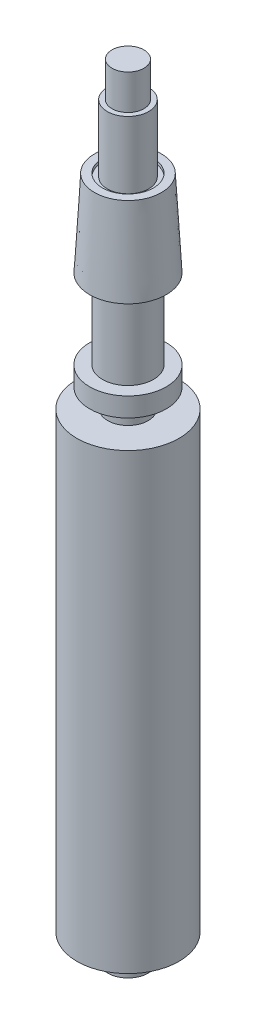
ISO-10303-21;
HEADER;
FILE_DESCRIPTION(('STEP AP214'),'2;1');
FILE_NAME('part.step','',(''),(''),'','','');
FILE_SCHEMA(('AUTOMOTIVE_DESIGN { 1 0 10303 214 1 1 1 1 }'));
ENDSEC;
DATA;
#1=APPLICATION_CONTEXT('core data for automotive mechanical design processes');
#2=APPLICATION_PROTOCOL_DEFINITION('international standard','automotive_design',2000,#1);
#3=PRODUCT_CONTEXT('',#1,'mechanical');
#4=PRODUCT('Part','Part','',(#3));
#5=PRODUCT_RELATED_PRODUCT_CATEGORY('part','',(#4));
#6=PRODUCT_DEFINITION_FORMATION('','',#4);
#7=PRODUCT_DEFINITION_CONTEXT('part definition',#1,'design');
#8=PRODUCT_DEFINITION('design','',#6,#7);
#9=PRODUCT_DEFINITION_SHAPE('','',#8);
#10=(LENGTH_UNIT() NAMED_UNIT(*) SI_UNIT(.MILLI.,.METRE.));
#11=(NAMED_UNIT(*) PLANE_ANGLE_UNIT() SI_UNIT($,.RADIAN.));
#12=(NAMED_UNIT(*) SI_UNIT($,.STERADIAN.) SOLID_ANGLE_UNIT());
#13=UNCERTAINTY_MEASURE_WITH_UNIT(LENGTH_MEASURE(1.E-05),#10,'distance_accuracy_value','');
#14=(GEOMETRIC_REPRESENTATION_CONTEXT(3) GLOBAL_UNCERTAINTY_ASSIGNED_CONTEXT((#13)) GLOBAL_UNIT_ASSIGNED_CONTEXT((#10,
#11,#12)) REPRESENTATION_CONTEXT('',''));
#15=CARTESIAN_POINT('',(0.,0.,0.));
#16=DIRECTION('',(0.,0.,1.));
#17=DIRECTION('',(1.,0.,0.));
#18=AXIS2_PLACEMENT_3D('',#15,#16,#17);
#19=CARTESIAN_POINT('',(0.,0.,0.));
#20=DIRECTION('',(0.,-1.,0.));
#21=DIRECTION('',(0.,0.,-1.));
#22=AXIS2_PLACEMENT_3D('',#19,#20,#21);
#23=PLANE('',#22);
#24=CARTESIAN_POINT('',(0.,0.,0.));
#25=DIRECTION('',(0.,1.,0.));
#26=DIRECTION('',(0.,0.,1.));
#27=AXIS2_PLACEMENT_3D('',#24,#25,#26);
#28=CIRCLE('',#27,5.);
#29=CARTESIAN_POINT('',(0.,0.,5.));
#30=VERTEX_POINT('',#29);
#31=EDGE_CURVE('E10',#30,#30,#28,.T.);
#32=ORIENTED_EDGE('',*,*,#31,.T.);
#33=EDGE_LOOP('',(#32));
#34=FACE_BOUND('',#33,.T.);
#35=ADVANCED_FACE('F43',(#34),#23,.F.);
#36=CARTESIAN_POINT('',(0.,0.,0.));
#37=DIRECTION('',(0.,1.,0.));
#38=DIRECTION('',(0.,0.,1.));
#39=AXIS2_PLACEMENT_3D('',#36,#37,#38);
#40=CYLINDRICAL_SURFACE('',#39,5.);
#41=ORIENTED_EDGE('',*,*,#31,.F.);
#42=EDGE_LOOP('',(#41));
#43=FACE_BOUND('',#42,.T.);
#44=CARTESIAN_POINT('',(0.,-11.,0.));
#45=DIRECTION('',(0.,1.,0.));
#46=DIRECTION('',(0.,0.,1.));
#47=AXIS2_PLACEMENT_3D('',#44,#45,#46);
#48=CIRCLE('',#47,5.);
#49=CARTESIAN_POINT('',(0.,-11.,5.));
#50=VERTEX_POINT('',#49);
#51=EDGE_CURVE('E49',#50,#50,#48,.T.);
#52=ORIENTED_EDGE('',*,*,#51,.T.);
#53=EDGE_LOOP('',(#52));
#54=FACE_BOUND('',#53,.T.);
#55=ADVANCED_FACE('F134',(#43,#54),#40,.T.);
#56=CARTESIAN_POINT('',(5.,-11.,0.));
#57=DIRECTION('',(0.,-1.,0.));
#58=DIRECTION('',(0.,0.,-1.));
#59=AXIS2_PLACEMENT_3D('',#56,#57,#58);
#60=PLANE('',#59);
#61=ORIENTED_EDGE('',*,*,#51,.F.);
#62=EDGE_LOOP('',(#61));
#63=FACE_BOUND('',#62,.T.);
#64=CARTESIAN_POINT('',(0.,-11.,0.));
#65=DIRECTION('',(0.,1.,0.));
#66=DIRECTION('',(0.,0.,1.));
#67=AXIS2_PLACEMENT_3D('',#64,#65,#66);
#68=CIRCLE('',#67,6.5);
#69=CARTESIAN_POINT('',(0.,-11.,6.5));
#70=VERTEX_POINT('',#69);
#71=EDGE_CURVE('E54',#70,#70,#68,.T.);
#72=ORIENTED_EDGE('',*,*,#71,.T.);
#73=EDGE_LOOP('',(#72));
#74=FACE_BOUND('',#73,.T.);
#75=ADVANCED_FACE('F137',(#63,#74),#60,.F.);
#76=CARTESIAN_POINT('',(0.,0.,0.));
#77=DIRECTION('',(0.,1.,0.));
#78=DIRECTION('',(0.,0.,1.));
#79=AXIS2_PLACEMENT_3D('',#76,#77,#78);
#80=CYLINDRICAL_SURFACE('',#79,6.5);
#81=ORIENTED_EDGE('',*,*,#71,.F.);
#82=EDGE_LOOP('',(#81));
#83=FACE_BOUND('',#82,.T.);
#84=CARTESIAN_POINT('',(0.,-32.,0.));
#85=DIRECTION('',(0.,1.,0.));
#86=DIRECTION('',(0.,0.,1.));
#87=AXIS2_PLACEMENT_3D('',#84,#85,#86);
#88=CIRCLE('',#87,6.5);
#89=CARTESIAN_POINT('',(0.,-32.,6.5));
#90=VERTEX_POINT('',#89);
#91=EDGE_CURVE('E58',#90,#90,#88,.T.);
#92=ORIENTED_EDGE('',*,*,#91,.T.);
#93=EDGE_LOOP('',(#92));
#94=FACE_BOUND('',#93,.T.);
#95=ADVANCED_FACE('F143',(#83,#94),#80,.T.);
#96=CARTESIAN_POINT('',(6.5,-32.,0.));
#97=DIRECTION('',(0.,-1.,0.));
#98=DIRECTION('',(0.,0.,-1.));
#99=AXIS2_PLACEMENT_3D('',#96,#97,#98);
#100=PLANE('',#99);
#101=ORIENTED_EDGE('',*,*,#91,.F.);
#102=EDGE_LOOP('',(#101));
#103=FACE_BOUND('',#102,.T.);
#104=CARTESIAN_POINT('',(0.,-32.,0.));
#105=DIRECTION('',(0.,1.,0.));
#106=DIRECTION('',(0.,0.,1.));
#107=AXIS2_PLACEMENT_3D('',#104,#105,#106);
#108=CIRCLE('',#107,8.00000000000001);
#109=CARTESIAN_POINT('',(0.,-32.,8.00000000000001));
#110=VERTEX_POINT('',#109);
#111=EDGE_CURVE('E67',#110,#110,#108,.T.);
#112=ORIENTED_EDGE('',*,*,#111,.T.);
#113=EDGE_LOOP('',(#112));
#114=FACE_BOUND('',#113,.T.);
#115=ADVANCED_FACE('F148',(#103,#114),#100,.F.);
#116=CARTESIAN_POINT('',(0.,0.,0.));
#117=DIRECTION('',(0.,1.,0.));
#118=DIRECTION('',(0.,0.,1.));
#119=AXIS2_PLACEMENT_3D('',#116,#117,#118);
#120=CYLINDRICAL_SURFACE('',#119,8.00000000000001);
#121=ORIENTED_EDGE('',*,*,#111,.F.);
#122=EDGE_LOOP('',(#121));
#123=FACE_BOUND('',#122,.T.);
#124=CARTESIAN_POINT('',(0.,-31.,0.));
#125=DIRECTION('',(0.,1.,0.));
#126=DIRECTION('',(0.,0.,1.));
#127=AXIS2_PLACEMENT_3D('',#124,#125,#126);
#128=CIRCLE('',#127,8.00000000000001);
#129=CARTESIAN_POINT('',(0.,-31.,8.00000000000001));
#130=VERTEX_POINT('',#129);
#131=EDGE_CURVE('E68',#130,#130,#128,.T.);
#132=ORIENTED_EDGE('',*,*,#131,.T.);
#133=EDGE_LOOP('',(#132));
#134=FACE_BOUND('',#133,.T.);
#135=ADVANCED_FACE('F153',(#123,#134),#120,.F.);
#136=CARTESIAN_POINT('',(10.5,-31.,0.));
#137=DIRECTION('',(0.,-1.,0.));
#138=DIRECTION('',(0.,0.,-1.));
#139=AXIS2_PLACEMENT_3D('',#136,#137,#138);
#140=PLANE('',#139);
#141=ORIENTED_EDGE('',*,*,#131,.F.);
#142=EDGE_LOOP('',(#141));
#143=FACE_BOUND('',#142,.T.);
#144=CARTESIAN_POINT('',(0.,-31.,0.));
#145=DIRECTION('',(0.,1.,0.));
#146=DIRECTION('',(0.,0.,1.));
#147=AXIS2_PLACEMENT_3D('',#144,#145,#146);
#148=CIRCLE('',#147,10.5);
#149=CARTESIAN_POINT('',(0.,-31.,10.5));
#150=VERTEX_POINT('',#149);
#151=EDGE_CURVE('E73',#150,#150,#148,.T.);
#152=ORIENTED_EDGE('',*,*,#151,.T.);
#153=EDGE_LOOP('',(#152));
#154=FACE_BOUND('',#153,.T.);
#155=ADVANCED_FACE('F156',(#143,#154),#140,.F.);
#156=CARTESIAN_POINT('',(0.,-58.,0.));
#157=DIRECTION('',(0.,-1.,0.));
#158=DIRECTION('',(0.,0.,-1.));
#159=AXIS2_PLACEMENT_3D('',#156,#157,#158);
#160=CONICAL_SURFACE('',#159,12.,0.055498505245717);
#161=ORIENTED_EDGE('',*,*,#151,.F.);
#162=EDGE_LOOP('',(#161));
#163=FACE_BOUND('',#162,.T.);
#164=CARTESIAN_POINT('',(0.,-58.,0.));
#165=DIRECTION('',(0.,1.,0.));
#166=DIRECTION('',(0.,0.,1.));
#167=AXIS2_PLACEMENT_3D('',#164,#165,#166);
#168=CIRCLE('',#167,12.);
#169=CARTESIAN_POINT('',(0.,-58.,12.));
#170=VERTEX_POINT('',#169);
#171=EDGE_CURVE('E76',#170,#170,#168,.T.);
#172=ORIENTED_EDGE('',*,*,#171,.T.);
#173=EDGE_LOOP('',(#172));
#174=FACE_BOUND('',#173,.T.);
#175=ADVANCED_FACE('F162',(#163,#174),#160,.T.);
#176=CARTESIAN_POINT('',(8.00000000000001,-58.,0.));
#177=DIRECTION('',(0.,1.,0.));
#178=DIRECTION('',(0.,0.,1.));
#179=AXIS2_PLACEMENT_3D('',#176,#177,#178);
#180=PLANE('',#179);
#181=ORIENTED_EDGE('',*,*,#171,.F.);
#182=EDGE_LOOP('',(#181));
#183=FACE_BOUND('',#182,.T.);
#184=CARTESIAN_POINT('',(0.,-58.,0.));
#185=DIRECTION('',(0.,1.,0.));
#186=DIRECTION('',(0.,0.,1.));
#187=AXIS2_PLACEMENT_3D('',#184,#185,#186);
#188=CIRCLE('',#187,8.00000000000001);
#189=CARTESIAN_POINT('',(0.,-58.,8.00000000000001));
#190=VERTEX_POINT('',#189);
#191=EDGE_CURVE('E85',#190,#190,#188,.T.);
#192=ORIENTED_EDGE('',*,*,#191,.T.);
#193=EDGE_LOOP('',(#192));
#194=FACE_BOUND('',#193,.T.);
#195=ADVANCED_FACE('F168',(#183,#194),#180,.F.);
#196=CARTESIAN_POINT('',(0.,0.,0.));
#197=DIRECTION('',(0.,1.,0.));
#198=DIRECTION('',(0.,0.,1.));
#199=AXIS2_PLACEMENT_3D('',#196,#197,#198);
#200=CYLINDRICAL_SURFACE('',#199,8.00000000000001);
#201=ORIENTED_EDGE('',*,*,#191,.F.);
#202=EDGE_LOOP('',(#201));
#203=FACE_BOUND('',#202,.T.);
#204=CARTESIAN_POINT('',(0.,-83.,0.));
#205=DIRECTION('',(0.,1.,0.));
#206=DIRECTION('',(0.,0.,1.));
#207=AXIS2_PLACEMENT_3D('',#204,#205,#206);
#208=CIRCLE('',#207,8.00000000000001);
#209=CARTESIAN_POINT('',(0.,-83.,8.00000000000001));
#210=VERTEX_POINT('',#209);
#211=EDGE_CURVE('E86',#210,#210,#208,.T.);
#212=ORIENTED_EDGE('',*,*,#211,.T.);
#213=EDGE_LOOP('',(#212));
#214=FACE_BOUND('',#213,.T.);
#215=ADVANCED_FACE('F169',(#203,#214),#200,.T.);
#216=CARTESIAN_POINT('',(8.00000000000001,-83.,0.));
#217=DIRECTION('',(0.,-1.,0.));
#218=DIRECTION('',(0.,0.,-1.));
#219=AXIS2_PLACEMENT_3D('',#216,#217,#218);
#220=PLANE('',#219);
#221=ORIENTED_EDGE('',*,*,#211,.F.);
#222=EDGE_LOOP('',(#221));
#223=FACE_BOUND('',#222,.T.);
#224=CARTESIAN_POINT('',(0.,-83.,0.));
#225=DIRECTION('',(0.,1.,0.));
#226=DIRECTION('',(0.,0.,1.));
#227=AXIS2_PLACEMENT_3D('',#224,#225,#226);
#228=CIRCLE('',#227,12.);
#229=CARTESIAN_POINT('',(0.,-83.,12.));
#230=VERTEX_POINT('',#229);
#231=EDGE_CURVE('E89',#230,#230,#228,.T.);
#232=ORIENTED_EDGE('',*,*,#231,.T.);
#233=EDGE_LOOP('',(#232));
#234=FACE_BOUND('',#233,.T.);
#235=ADVANCED_FACE('F174',(#223,#234),#220,.F.);
#236=CARTESIAN_POINT('',(0.,0.,0.));
#237=DIRECTION('',(0.,1.,0.));
#238=DIRECTION('',(0.,0.,1.));
#239=AXIS2_PLACEMENT_3D('',#236,#237,#238);
#240=CYLINDRICAL_SURFACE('',#239,12.);
#241=ORIENTED_EDGE('',*,*,#231,.F.);
#242=EDGE_LOOP('',(#241));
#243=FACE_BOUND('',#242,.T.);
#244=CARTESIAN_POINT('',(0.,-89.,0.));
#245=DIRECTION('',(0.,1.,0.));
#246=DIRECTION('',(0.,0.,1.));
#247=AXIS2_PLACEMENT_3D('',#244,#245,#246);
#248=CIRCLE('',#247,12.);
#249=CARTESIAN_POINT('',(0.,-89.,12.));
#250=VERTEX_POINT('',#249);
#251=EDGE_CURVE('E92',#250,#250,#248,.T.);
#252=ORIENTED_EDGE('',*,*,#251,.T.);
#253=EDGE_LOOP('',(#252));
#254=FACE_BOUND('',#253,.T.);
#255=ADVANCED_FACE('F178',(#243,#254),#240,.T.);
#256=CARTESIAN_POINT('',(12.,-89.,0.));
#257=DIRECTION('',(0.,1.,0.));
#258=DIRECTION('',(0.,0.,1.));
#259=AXIS2_PLACEMENT_3D('',#256,#257,#258);
#260=PLANE('',#259);
#261=ORIENTED_EDGE('',*,*,#251,.F.);
#262=EDGE_LOOP('',(#261));
#263=FACE_BOUND('',#262,.T.);
#264=CARTESIAN_POINT('',(0.,-89.,0.));
#265=DIRECTION('',(0.,1.,0.));
#266=DIRECTION('',(0.,0.,1.));
#267=AXIS2_PLACEMENT_3D('',#264,#265,#266);
#268=CIRCLE('',#267,6.3659490771675);
#269=CARTESIAN_POINT('',(0.,-89.,6.3659490771675));
#270=VERTEX_POINT('',#269);
#271=EDGE_CURVE('E97',#270,#270,#268,.T.);
#272=ORIENTED_EDGE('',*,*,#271,.T.);
#273=EDGE_LOOP('',(#272));
#274=FACE_BOUND('',#273,.T.);
#275=ADVANCED_FACE('F185',(#263,#274),#260,.F.);
#276=CARTESIAN_POINT('',(0.,0.,0.));
#277=DIRECTION('',(0.,1.,0.));
#278=DIRECTION('',(0.,0.,1.));
#279=AXIS2_PLACEMENT_3D('',#276,#277,#278);
#280=CYLINDRICAL_SURFACE('',#279,6.3659490771675);
#281=ORIENTED_EDGE('',*,*,#271,.F.);
#282=EDGE_LOOP('',(#281));
#283=FACE_BOUND('',#282,.T.);
#284=CARTESIAN_POINT('',(0.,-95.,0.));
#285=DIRECTION('',(0.,1.,0.));
#286=DIRECTION('',(0.,0.,1.));
#287=AXIS2_PLACEMENT_3D('',#284,#285,#286);
#288=CIRCLE('',#287,6.3659490771675);
#289=CARTESIAN_POINT('',(0.,-95.,6.3659490771675));
#290=VERTEX_POINT('',#289);
#291=EDGE_CURVE('E105',#290,#290,#288,.T.);
#292=ORIENTED_EDGE('',*,*,#291,.T.);
#293=EDGE_LOOP('',(#292));
#294=FACE_BOUND('',#293,.T.);
#295=ADVANCED_FACE('F186',(#283,#294),#280,.T.);
#296=CARTESIAN_POINT('',(6.3659490771675,-95.,0.));
#297=DIRECTION('',(0.,-1.,0.));
#298=DIRECTION('',(0.,0.,-1.));
#299=AXIS2_PLACEMENT_3D('',#296,#297,#298);
#300=PLANE('',#299);
#301=ORIENTED_EDGE('',*,*,#291,.F.);
#302=EDGE_LOOP('',(#301));
#303=FACE_BOUND('',#302,.T.);
#304=CARTESIAN_POINT('',(0.,-95.,0.));
#305=DIRECTION('',(0.,1.,0.));
#306=DIRECTION('',(0.,0.,1.));
#307=AXIS2_PLACEMENT_3D('',#304,#305,#306);
#308=CIRCLE('',#307,16.);
#309=CARTESIAN_POINT('',(0.,-95.,16.));
#310=VERTEX_POINT('',#309);
#311=EDGE_CURVE('E106',#310,#310,#308,.T.);
#312=ORIENTED_EDGE('',*,*,#311,.T.);
#313=EDGE_LOOP('',(#312));
#314=FACE_BOUND('',#313,.T.);
#315=ADVANCED_FACE('F189',(#303,#314),#300,.F.);
#316=CARTESIAN_POINT('',(0.,0.,0.));
#317=DIRECTION('',(0.,1.,0.));
#318=DIRECTION('',(0.,0.,1.));
#319=AXIS2_PLACEMENT_3D('',#316,#317,#318);
#320=CYLINDRICAL_SURFACE('',#319,16.);
#321=ORIENTED_EDGE('',*,*,#311,.F.);
#322=EDGE_LOOP('',(#321));
#323=FACE_BOUND('',#322,.T.);
#324=CARTESIAN_POINT('',(0.,-237.,0.));
#325=DIRECTION('',(0.,1.,0.));
#326=DIRECTION('',(0.,0.,1.));
#327=AXIS2_PLACEMENT_3D('',#324,#325,#326);
#328=CIRCLE('',#327,16.);
#329=CARTESIAN_POINT('',(0.,-237.,16.));
#330=VERTEX_POINT('',#329);
#331=EDGE_CURVE('E110',#330,#330,#328,.T.);
#332=ORIENTED_EDGE('',*,*,#331,.T.);
#333=EDGE_LOOP('',(#332));
#334=FACE_BOUND('',#333,.T.);
#335=ADVANCED_FACE('F191',(#323,#334),#320,.T.);
#336=CARTESIAN_POINT('',(16.,-237.,0.));
#337=DIRECTION('',(0.,1.,0.));
#338=DIRECTION('',(0.,0.,1.));
#339=AXIS2_PLACEMENT_3D('',#336,#337,#338);
#340=PLANE('',#339);
#341=ORIENTED_EDGE('',*,*,#331,.F.);
#342=EDGE_LOOP('',(#341));
#343=FACE_BOUND('',#342,.T.);
#344=CARTESIAN_POINT('',(0.,-237.,0.));
#345=DIRECTION('',(0.,1.,0.));
#346=DIRECTION('',(0.,0.,1.));
#347=AXIS2_PLACEMENT_3D('',#344,#345,#346);
#348=CIRCLE('',#347,6.3659490771675);
#349=CARTESIAN_POINT('',(0.,-237.,6.3659490771675));
#350=VERTEX_POINT('',#349);
#351=EDGE_CURVE('E114',#350,#350,#348,.T.);
#352=ORIENTED_EDGE('',*,*,#351,.T.);
#353=EDGE_LOOP('',(#352));
#354=FACE_BOUND('',#353,.T.);
#355=ADVANCED_FACE('F131',(#343,#354),#340,.F.);
#356=CARTESIAN_POINT('',(0.,0.,0.));
#357=DIRECTION('',(0.,1.,0.));
#358=DIRECTION('',(0.,0.,1.));
#359=AXIS2_PLACEMENT_3D('',#356,#357,#358);
#360=CYLINDRICAL_SURFACE('',#359,6.3659490771675);
#361=ORIENTED_EDGE('',*,*,#351,.F.);
#362=EDGE_LOOP('',(#361));
#363=FACE_BOUND('',#362,.T.);
#364=CARTESIAN_POINT('',(0.,-245.,0.));
#365=DIRECTION('',(0.,1.,0.));
#366=DIRECTION('',(0.,0.,1.));
#367=AXIS2_PLACEMENT_3D('',#364,#365,#366);
#368=CIRCLE('',#367,6.3659490771675);
#369=CARTESIAN_POINT('',(0.,-245.,6.3659490771675));
#370=VERTEX_POINT('',#369);
#371=EDGE_CURVE('E119',#370,#370,#368,.T.);
#372=ORIENTED_EDGE('',*,*,#371,.T.);
#373=EDGE_LOOP('',(#372));
#374=FACE_BOUND('',#373,.T.);
#375=ADVANCED_FACE('F121',(#363,#374),#360,.T.);
#376=CARTESIAN_POINT('',(6.3659490771675,-245.,0.));
#377=DIRECTION('',(0.,1.,0.));
#378=DIRECTION('',(0.,0.,1.));
#379=AXIS2_PLACEMENT_3D('',#376,#377,#378);
#380=PLANE('',#379);
#381=ORIENTED_EDGE('',*,*,#371,.F.);
#382=EDGE_LOOP('',(#381));
#383=FACE_BOUND('',#382,.T.);
#384=ADVANCED_FACE('F124',(#383),#380,.F.);
#385=CLOSED_SHELL('',(#35,#55,#75,#95,#115,#135,#155,#175,#195,#215,#235,#255,#275,#295,#315,
#335,#355,#375,#384));
#386=MANIFOLD_SOLID_BREP('B2',#385);
#387=ADVANCED_BREP_SHAPE_REPRESENTATION('',(#18,#386),#14);
#388=SHAPE_DEFINITION_REPRESENTATION(#9,#387);
ENDSEC;
END-ISO-10303-21;
